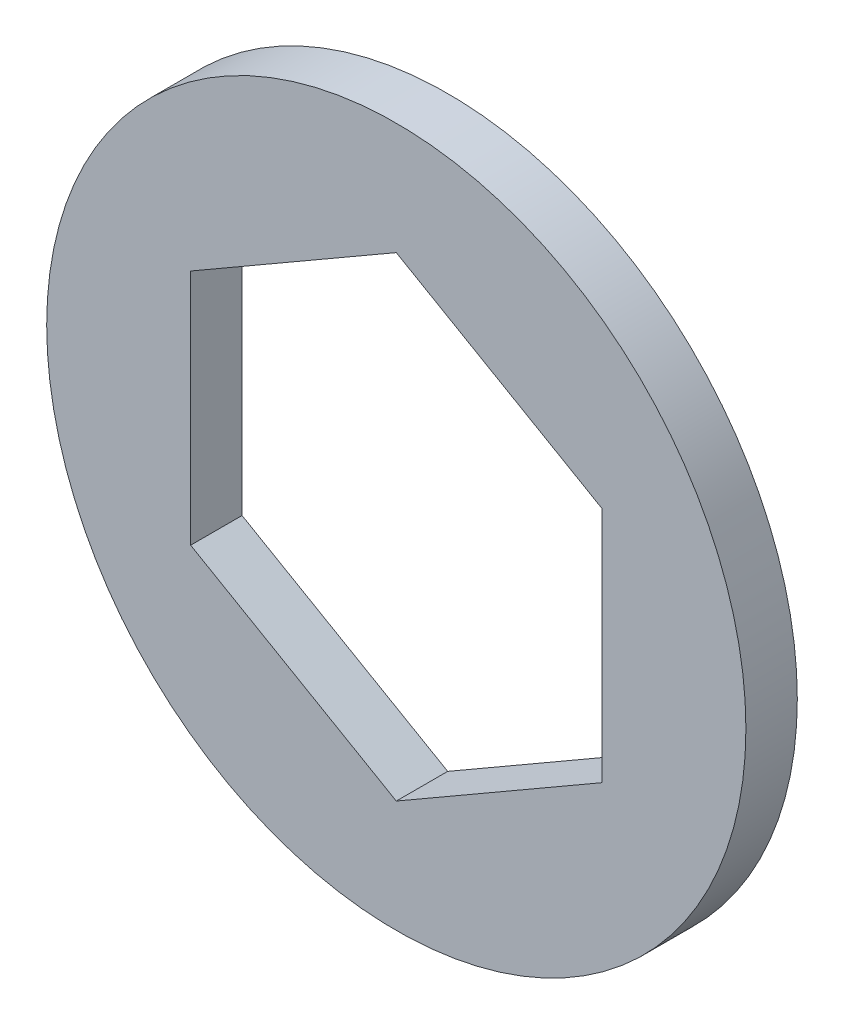
ISO-10303-21;
HEADER;
FILE_DESCRIPTION(('STEP AP214'),'2;1');
FILE_NAME('part.step','',(''),(''),'','','');
FILE_SCHEMA(('AUTOMOTIVE_DESIGN { 1 0 10303 214 1 1 1 1 }'));
ENDSEC;
DATA;
#1=APPLICATION_CONTEXT('core data for automotive mechanical design processes');
#2=APPLICATION_PROTOCOL_DEFINITION('international standard','automotive_design',2000,#1);
#3=PRODUCT_CONTEXT('',#1,'mechanical');
#4=PRODUCT('Part','Part','',(#3));
#5=PRODUCT_RELATED_PRODUCT_CATEGORY('part','',(#4));
#6=PRODUCT_DEFINITION_FORMATION('','',#4);
#7=PRODUCT_DEFINITION_CONTEXT('part definition',#1,'design');
#8=PRODUCT_DEFINITION('design','',#6,#7);
#9=PRODUCT_DEFINITION_SHAPE('','',#8);
#10=(LENGTH_UNIT() NAMED_UNIT(*) SI_UNIT(.MILLI.,.METRE.));
#11=(NAMED_UNIT(*) PLANE_ANGLE_UNIT() SI_UNIT($,.RADIAN.));
#12=(NAMED_UNIT(*) SI_UNIT($,.STERADIAN.) SOLID_ANGLE_UNIT());
#13=UNCERTAINTY_MEASURE_WITH_UNIT(LENGTH_MEASURE(1.E-05),#10,'distance_accuracy_value','');
#14=(GEOMETRIC_REPRESENTATION_CONTEXT(3) GLOBAL_UNCERTAINTY_ASSIGNED_CONTEXT((#13)) GLOBAL_UNIT_ASSIGNED_CONTEXT((#10,
#11,#12)) REPRESENTATION_CONTEXT('',''));
#15=CARTESIAN_POINT('',(0.,0.,0.));
#16=DIRECTION('',(0.,0.,1.));
#17=DIRECTION('',(1.,0.,0.));
#18=AXIS2_PLACEMENT_3D('',#15,#16,#17);
#19=CARTESIAN_POINT('',(0.,0.,0.79375));
#20=DIRECTION('',(0.,0.,1.));
#21=DIRECTION('',(1.,0.,0.));
#22=AXIS2_PLACEMENT_3D('',#19,#20,#21);
#23=PLANE('',#22);
#24=CARTESIAN_POINT('',(0.,0.,0.79375));
#25=DIRECTION('',(0.,0.,1.));
#26=DIRECTION('',(1.,0.,0.));
#27=AXIS2_PLACEMENT_3D('',#24,#25,#26);
#28=CIRCLE('',#27,10.795);
#29=CARTESIAN_POINT('',(10.795,0.,0.79375));
#30=VERTEX_POINT('',#29);
#31=EDGE_CURVE('E11',#30,#30,#28,.T.);
#32=ORIENTED_EDGE('',*,*,#31,.T.);
#33=EDGE_LOOP('',(#32));
#34=FACE_BOUND('',#33,.T.);
#35=DIRECTION('',(-0.866025403784438,-0.5,0.));
#36=VECTOR('',#35,1.);
#37=CARTESIAN_POINT('',(0.,7.33234841870825,0.79375));
#38=LINE('',#37,#36);
#39=CARTESIAN_POINT('',(0.,7.33234841870825,0.79375));
#40=VERTEX_POINT('',#39);
#41=CARTESIAN_POINT('',(-6.35,3.66617420935412,0.79375));
#42=VERTEX_POINT('',#41);
#43=EDGE_CURVE('E98',#40,#42,#38,.T.);
#44=ORIENTED_EDGE('',*,*,#43,.F.);
#45=DIRECTION('',(-0.866025403784439,0.5,0.));
#46=VECTOR('',#45,1.);
#47=CARTESIAN_POINT('',(6.35,3.66617420935412,0.79375));
#48=LINE('',#47,#46);
#49=CARTESIAN_POINT('',(6.35,3.66617420935412,0.79375));
#50=VERTEX_POINT('',#49);
#51=EDGE_CURVE('E90',#50,#40,#48,.T.);
#52=ORIENTED_EDGE('',*,*,#51,.F.);
#53=DIRECTION('',(0.,1.,0.));
#54=VECTOR('',#53,1.);
#55=CARTESIAN_POINT('',(6.35,-3.66617420935412,0.79375));
#56=LINE('',#55,#54);
#57=CARTESIAN_POINT('',(6.35,-3.66617420935412,0.79375));
#58=VERTEX_POINT('',#57);
#59=EDGE_CURVE('E118',#58,#50,#56,.T.);
#60=ORIENTED_EDGE('',*,*,#59,.F.);
#61=DIRECTION('',(0.866025403784439,0.5,0.));
#62=VECTOR('',#61,1.);
#63=CARTESIAN_POINT('',(0.,-7.33234841870825,0.79375));
#64=LINE('',#63,#62);
#65=CARTESIAN_POINT('',(0.,-7.33234841870825,0.79375));
#66=VERTEX_POINT('',#65);
#67=EDGE_CURVE('E116',#66,#58,#64,.T.);
#68=ORIENTED_EDGE('',*,*,#67,.F.);
#69=DIRECTION('',(0.866025403784439,-0.5,0.));
#70=VECTOR('',#69,1.);
#71=CARTESIAN_POINT('',(-6.35,-3.66617420935412,0.79375));
#72=LINE('',#71,#70);
#73=CARTESIAN_POINT('',(-6.35,-3.66617420935412,0.79375));
#74=VERTEX_POINT('',#73);
#75=EDGE_CURVE('E112',#74,#66,#72,.T.);
#76=ORIENTED_EDGE('',*,*,#75,.F.);
#77=DIRECTION('',(0.,-1.,0.));
#78=VECTOR('',#77,1.);
#79=CARTESIAN_POINT('',(-6.35,3.66617420935412,0.79375));
#80=LINE('',#79,#78);
#81=EDGE_CURVE('E110',#42,#74,#80,.T.);
#82=ORIENTED_EDGE('',*,*,#81,.F.);
#83=EDGE_LOOP('',(#44,#52,#60,#68,#76,#82));
#84=FACE_BOUND('',#83,.T.);
#85=ADVANCED_FACE('F37',(#34,#84),#23,.T.);
#86=CARTESIAN_POINT('',(0.,0.,-0.79375));
#87=DIRECTION('',(0.,0.,1.));
#88=DIRECTION('',(1.,0.,0.));
#89=AXIS2_PLACEMENT_3D('',#86,#87,#88);
#90=PLANE('',#89);
#91=CARTESIAN_POINT('',(0.,0.,-0.79375));
#92=DIRECTION('',(0.,0.,1.));
#93=DIRECTION('',(1.,0.,0.));
#94=AXIS2_PLACEMENT_3D('',#91,#92,#93);
#95=CIRCLE('',#94,10.795);
#96=CARTESIAN_POINT('',(10.795,0.,-0.79375));
#97=VERTEX_POINT('',#96);
#98=EDGE_CURVE('E41',#97,#97,#95,.T.);
#99=ORIENTED_EDGE('',*,*,#98,.F.);
#100=EDGE_LOOP('',(#99));
#101=FACE_BOUND('',#100,.T.);
#102=DIRECTION('',(-0.866025403784439,0.5,0.));
#103=VECTOR('',#102,1.);
#104=CARTESIAN_POINT('',(6.35,3.66617420935412,-0.79375));
#105=LINE('',#104,#103);
#106=CARTESIAN_POINT('',(6.35,3.66617420935412,-0.79375));
#107=VERTEX_POINT('',#106);
#108=CARTESIAN_POINT('',(0.,7.33234841870825,-0.79375));
#109=VERTEX_POINT('',#108);
#110=EDGE_CURVE('E60',#107,#109,#105,.T.);
#111=ORIENTED_EDGE('',*,*,#110,.T.);
#112=DIRECTION('',(-0.866025403784438,-0.5,0.));
#113=VECTOR('',#112,1.);
#114=CARTESIAN_POINT('',(0.,7.33234841870825,-0.79375));
#115=LINE('',#114,#113);
#116=CARTESIAN_POINT('',(-6.35,3.66617420935412,-0.79375));
#117=VERTEX_POINT('',#116);
#118=EDGE_CURVE('E105',#109,#117,#115,.T.);
#119=ORIENTED_EDGE('',*,*,#118,.T.);
#120=DIRECTION('',(0.,-1.,0.));
#121=VECTOR('',#120,1.);
#122=CARTESIAN_POINT('',(-6.35,3.66617420935412,-0.79375));
#123=LINE('',#122,#121);
#124=CARTESIAN_POINT('',(-6.35,-3.66617420935412,-0.79375));
#125=VERTEX_POINT('',#124);
#126=EDGE_CURVE('E122',#117,#125,#123,.T.);
#127=ORIENTED_EDGE('',*,*,#126,.T.);
#128=DIRECTION('',(0.866025403784439,-0.5,0.));
#129=VECTOR('',#128,1.);
#130=CARTESIAN_POINT('',(-6.35,-3.66617420935412,-0.79375));
#131=LINE('',#130,#129);
#132=CARTESIAN_POINT('',(0.,-7.33234841870825,-0.79375));
#133=VERTEX_POINT('',#132);
#134=EDGE_CURVE('E125',#125,#133,#131,.T.);
#135=ORIENTED_EDGE('',*,*,#134,.T.);
#136=DIRECTION('',(0.866025403784439,0.5,0.));
#137=VECTOR('',#136,1.);
#138=CARTESIAN_POINT('',(0.,-7.33234841870825,-0.79375));
#139=LINE('',#138,#137);
#140=CARTESIAN_POINT('',(6.35,-3.66617420935412,-0.79375));
#141=VERTEX_POINT('',#140);
#142=EDGE_CURVE('E128',#133,#141,#139,.T.);
#143=ORIENTED_EDGE('',*,*,#142,.T.);
#144=DIRECTION('',(0.,1.,0.));
#145=VECTOR('',#144,1.);
#146=CARTESIAN_POINT('',(6.35,-3.66617420935412,-0.79375));
#147=LINE('',#146,#145);
#148=EDGE_CURVE('E99',#141,#107,#147,.T.);
#149=ORIENTED_EDGE('',*,*,#148,.T.);
#150=EDGE_LOOP('',(#111,#119,#127,#135,#143,#149));
#151=FACE_BOUND('',#150,.T.);
#152=ADVANCED_FACE('F145',(#101,#151),#90,.F.);
#153=CARTESIAN_POINT('',(0.,0.,0.79375));
#154=DIRECTION('',(0.,0.,-1.));
#155=DIRECTION('',(-1.,0.,0.));
#156=AXIS2_PLACEMENT_3D('',#153,#154,#155);
#157=CYLINDRICAL_SURFACE('',#156,10.795);
#158=ORIENTED_EDGE('',*,*,#31,.F.);
#159=EDGE_LOOP('',(#158));
#160=FACE_BOUND('',#159,.T.);
#161=ORIENTED_EDGE('',*,*,#98,.T.);
#162=EDGE_LOOP('',(#161));
#163=FACE_BOUND('',#162,.T.);
#164=ADVANCED_FACE('F39',(#160,#163),#157,.T.);
#165=CARTESIAN_POINT('',(6.35,3.66617420935412,0.79375));
#166=DIRECTION('',(-0.5,-0.866025403784439,0.));
#167=DIRECTION('',(0.866025403784439,-0.5,0.));
#168=AXIS2_PLACEMENT_3D('',#165,#166,#167);
#169=PLANE('',#168);
#170=ORIENTED_EDGE('',*,*,#110,.F.);
#171=DIRECTION('',(0.,0.,-1.));
#172=VECTOR('',#171,1.);
#173=CARTESIAN_POINT('',(6.35,3.66617420935412,0.79375));
#174=LINE('',#173,#172);
#175=EDGE_CURVE('E94',#50,#107,#174,.T.);
#176=ORIENTED_EDGE('',*,*,#175,.F.);
#177=ORIENTED_EDGE('',*,*,#51,.T.);
#178=DIRECTION('',(0.,0.,-1.));
#179=VECTOR('',#178,1.);
#180=CARTESIAN_POINT('',(0.,7.33234841870825,0.79375));
#181=LINE('',#180,#179);
#182=EDGE_CURVE('E93',#40,#109,#181,.T.);
#183=ORIENTED_EDGE('',*,*,#182,.T.);
#184=EDGE_LOOP('',(#170,#176,#177,#183));
#185=FACE_BOUND('',#184,.T.);
#186=ADVANCED_FACE('F92',(#185),#169,.T.);
#187=CARTESIAN_POINT('',(0.,7.33234841870825,0.79375));
#188=DIRECTION('',(0.5,-0.866025403784438,0.));
#189=DIRECTION('',(0.866025403784439,0.5,0.));
#190=AXIS2_PLACEMENT_3D('',#187,#188,#189);
#191=PLANE('',#190);
#192=ORIENTED_EDGE('',*,*,#118,.F.);
#193=ORIENTED_EDGE('',*,*,#182,.F.);
#194=ORIENTED_EDGE('',*,*,#43,.T.);
#195=DIRECTION('',(0.,0.,-1.));
#196=VECTOR('',#195,1.);
#197=CARTESIAN_POINT('',(-6.35,3.66617420935412,0.79375));
#198=LINE('',#197,#196);
#199=EDGE_CURVE('E106',#42,#117,#198,.T.);
#200=ORIENTED_EDGE('',*,*,#199,.T.);
#201=EDGE_LOOP('',(#192,#193,#194,#200));
#202=FACE_BOUND('',#201,.T.);
#203=ADVANCED_FACE('F102',(#202),#191,.T.);
#204=CARTESIAN_POINT('',(-6.35,3.66617420935412,0.79375));
#205=DIRECTION('',(1.,0.,0.));
#206=DIRECTION('',(0.,1.,0.));
#207=AXIS2_PLACEMENT_3D('',#204,#205,#206);
#208=PLANE('',#207);
#209=ORIENTED_EDGE('',*,*,#126,.F.);
#210=ORIENTED_EDGE('',*,*,#199,.F.);
#211=ORIENTED_EDGE('',*,*,#81,.T.);
#212=DIRECTION('',(0.,0.,-1.));
#213=VECTOR('',#212,1.);
#214=CARTESIAN_POINT('',(-6.35,-3.66617420935412,0.79375));
#215=LINE('',#214,#213);
#216=EDGE_CURVE('E137',#74,#125,#215,.T.);
#217=ORIENTED_EDGE('',*,*,#216,.T.);
#218=EDGE_LOOP('',(#209,#210,#211,#217));
#219=FACE_BOUND('',#218,.T.);
#220=ADVANCED_FACE('F141',(#219),#208,.T.);
#221=CARTESIAN_POINT('',(-6.35,-3.66617420935412,0.79375));
#222=DIRECTION('',(0.5,0.866025403784439,0.));
#223=DIRECTION('',(-0.866025403784439,0.5,0.));
#224=AXIS2_PLACEMENT_3D('',#221,#222,#223);
#225=PLANE('',#224);
#226=ORIENTED_EDGE('',*,*,#134,.F.);
#227=ORIENTED_EDGE('',*,*,#216,.F.);
#228=ORIENTED_EDGE('',*,*,#75,.T.);
#229=DIRECTION('',(0.,0.,-1.));
#230=VECTOR('',#229,1.);
#231=CARTESIAN_POINT('',(0.,-7.33234841870825,0.79375));
#232=LINE('',#231,#230);
#233=EDGE_CURVE('E135',#66,#133,#232,.T.);
#234=ORIENTED_EDGE('',*,*,#233,.T.);
#235=EDGE_LOOP('',(#226,#227,#228,#234));
#236=FACE_BOUND('',#235,.T.);
#237=ADVANCED_FACE('F153',(#236),#225,.T.);
#238=CARTESIAN_POINT('',(0.,-7.33234841870825,0.79375));
#239=DIRECTION('',(-0.5,0.866025403784439,0.));
#240=DIRECTION('',(-0.866025403784439,-0.5,0.));
#241=AXIS2_PLACEMENT_3D('',#238,#239,#240);
#242=PLANE('',#241);
#243=ORIENTED_EDGE('',*,*,#142,.F.);
#244=ORIENTED_EDGE('',*,*,#233,.F.);
#245=ORIENTED_EDGE('',*,*,#67,.T.);
#246=DIRECTION('',(0.,0.,-1.));
#247=VECTOR('',#246,1.);
#248=CARTESIAN_POINT('',(6.35,-3.66617420935412,0.79375));
#249=LINE('',#248,#247);
#250=EDGE_CURVE('E52',#58,#141,#249,.T.);
#251=ORIENTED_EDGE('',*,*,#250,.T.);
#252=EDGE_LOOP('',(#243,#244,#245,#251));
#253=FACE_BOUND('',#252,.T.);
#254=ADVANCED_FACE('F151',(#253),#242,.T.);
#255=CARTESIAN_POINT('',(6.35,-3.66617420935412,0.79375));
#256=DIRECTION('',(-1.,0.,0.));
#257=DIRECTION('',(0.,-1.,0.));
#258=AXIS2_PLACEMENT_3D('',#255,#256,#257);
#259=PLANE('',#258);
#260=ORIENTED_EDGE('',*,*,#148,.F.);
#261=ORIENTED_EDGE('',*,*,#250,.F.);
#262=ORIENTED_EDGE('',*,*,#59,.T.);
#263=ORIENTED_EDGE('',*,*,#175,.T.);
#264=EDGE_LOOP('',(#260,#261,#262,#263));
#265=FACE_BOUND('',#264,.T.);
#266=ADVANCED_FACE('F147',(#265),#259,.T.);
#267=CLOSED_SHELL('',(#85,#152,#164,#186,#203,#220,#237,#254,#266));
#268=MANIFOLD_SOLID_BREP('B2',#267);
#269=ADVANCED_BREP_SHAPE_REPRESENTATION('',(#18,#268),#14);
#270=SHAPE_DEFINITION_REPRESENTATION(#9,#269);
ENDSEC;
END-ISO-10303-21;
